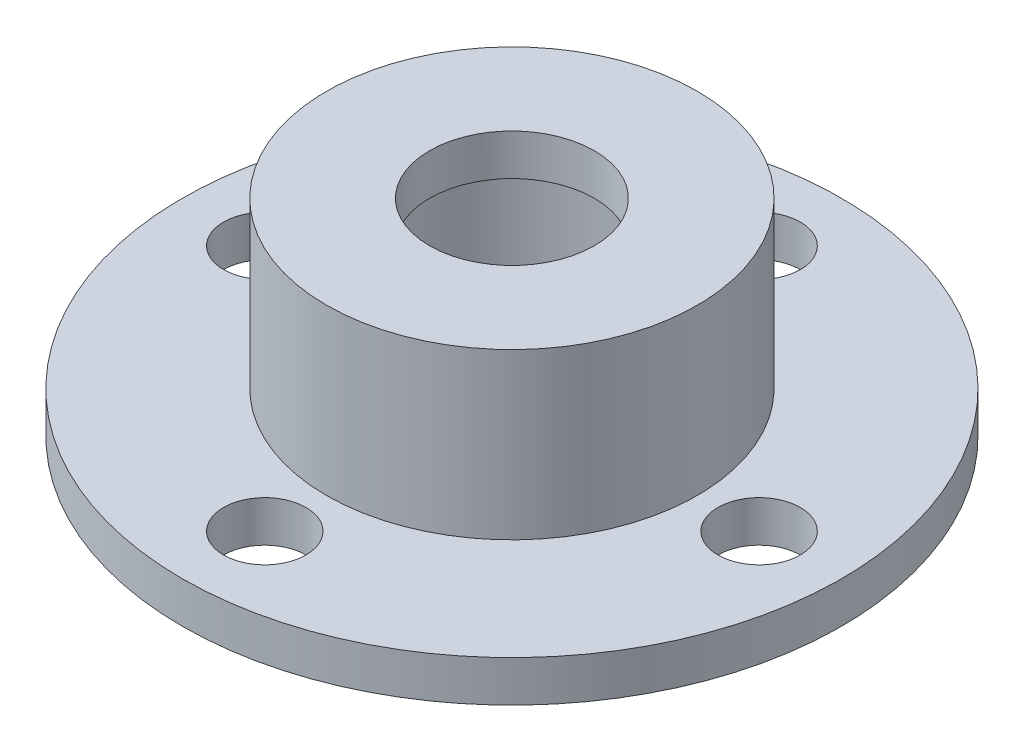
ISO-10303-21;
HEADER;
FILE_DESCRIPTION(('STEP AP214'),'2;1');
FILE_NAME('part.step','',(''),(''),'','','');
FILE_SCHEMA(('AUTOMOTIVE_DESIGN { 1 0 10303 214 1 1 1 1 }'));
ENDSEC;
DATA;
#1=APPLICATION_CONTEXT('core data for automotive mechanical design processes');
#2=APPLICATION_PROTOCOL_DEFINITION('international standard','automotive_design',2000,#1);
#3=PRODUCT_CONTEXT('',#1,'mechanical');
#4=PRODUCT('Part','Part','',(#3));
#5=PRODUCT_RELATED_PRODUCT_CATEGORY('part','',(#4));
#6=PRODUCT_DEFINITION_FORMATION('','',#4);
#7=PRODUCT_DEFINITION_CONTEXT('part definition',#1,'design');
#8=PRODUCT_DEFINITION('design','',#6,#7);
#9=PRODUCT_DEFINITION_SHAPE('','',#8);
#10=(LENGTH_UNIT() NAMED_UNIT(*) SI_UNIT(.MILLI.,.METRE.));
#11=(NAMED_UNIT(*) PLANE_ANGLE_UNIT() SI_UNIT($,.RADIAN.));
#12=(NAMED_UNIT(*) SI_UNIT($,.STERADIAN.) SOLID_ANGLE_UNIT());
#13=UNCERTAINTY_MEASURE_WITH_UNIT(LENGTH_MEASURE(1.E-05),#10,'distance_accuracy_value','');
#14=(GEOMETRIC_REPRESENTATION_CONTEXT(3) GLOBAL_UNCERTAINTY_ASSIGNED_CONTEXT((#13)) GLOBAL_UNIT_ASSIGNED_CONTEXT((#10,
#11,#12)) REPRESENTATION_CONTEXT('',''));
#15=CARTESIAN_POINT('',(0.,0.,0.));
#16=DIRECTION('',(0.,0.,1.));
#17=DIRECTION('',(1.,0.,0.));
#18=AXIS2_PLACEMENT_3D('',#15,#16,#17);
#19=CARTESIAN_POINT('',(0.,25.4,0.));
#20=DIRECTION('',(0.,-1.,0.));
#21=DIRECTION('',(0.,0.,-1.));
#22=AXIS2_PLACEMENT_3D('',#19,#20,#21);
#23=CYLINDRICAL_SURFACE('',#22,50.8);
#24=CARTESIAN_POINT('',(0.,127.,0.));
#25=DIRECTION('',(0.,1.,0.));
#26=DIRECTION('',(0.,0.,1.));
#27=AXIS2_PLACEMENT_3D('',#24,#25,#26);
#28=CIRCLE('',#27,50.8);
#29=CARTESIAN_POINT('',(0.,127.,50.8));
#30=VERTEX_POINT('',#29);
#31=EDGE_CURVE('E128',#30,#30,#28,.T.);
#32=ORIENTED_EDGE('',*,*,#31,.T.);
#33=EDGE_LOOP('',(#32));
#34=FACE_BOUND('',#33,.T.);
#35=CARTESIAN_POINT('',(0.,101.6,0.));
#36=DIRECTION('',(0.,-1.,0.));
#37=DIRECTION('',(0.,0.,-1.));
#38=AXIS2_PLACEMENT_3D('',#35,#36,#37);
#39=CIRCLE('',#38,50.8);
#40=CARTESIAN_POINT('',(0.,101.6,-50.8));
#41=VERTEX_POINT('',#40);
#42=EDGE_CURVE('E35',#41,#41,#39,.T.);
#43=ORIENTED_EDGE('',*,*,#42,.T.);
#44=EDGE_LOOP('',(#43));
#45=FACE_BOUND('',#44,.T.);
#46=ADVANCED_FACE('F31',(#34,#45),#23,.F.);
#47=CARTESIAN_POINT('',(0.,25.4,0.));
#48=DIRECTION('',(0.,1.,0.));
#49=DIRECTION('',(0.,0.,1.));
#50=AXIS2_PLACEMENT_3D('',#47,#48,#49);
#51=PLANE('',#50);
#52=CARTESIAN_POINT('',(0.,25.4,152.4));
#53=DIRECTION('',(0.,1.,0.));
#54=DIRECTION('',(0.,0.,1.));
#55=AXIS2_PLACEMENT_3D('',#52,#53,#54);
#56=CIRCLE('',#55,25.4);
#57=CARTESIAN_POINT('',(0.,25.4,177.8));
#58=VERTEX_POINT('',#57);
#59=EDGE_CURVE('E10',#58,#58,#56,.T.);
#60=ORIENTED_EDGE('',*,*,#59,.F.);
#61=EDGE_LOOP('',(#60));
#62=FACE_BOUND('',#61,.T.);
#63=CARTESIAN_POINT('',(152.4,25.4,0.));
#64=DIRECTION('',(0.,1.,0.));
#65=DIRECTION('',(0.,0.,1.));
#66=AXIS2_PLACEMENT_3D('',#63,#64,#65);
#67=CIRCLE('',#66,25.4);
#68=CARTESIAN_POINT('',(152.4,25.4,25.4));
#69=VERTEX_POINT('',#68);
#70=EDGE_CURVE('E39',#69,#69,#67,.T.);
#71=ORIENTED_EDGE('',*,*,#70,.F.);
#72=EDGE_LOOP('',(#71));
#73=FACE_BOUND('',#72,.T.);
#74=CARTESIAN_POINT('',(0.,25.4,0.));
#75=DIRECTION('',(0.,1.,0.));
#76=DIRECTION('',(0.,0.,1.));
#77=AXIS2_PLACEMENT_3D('',#74,#75,#76);
#78=CIRCLE('',#77,203.2);
#79=CARTESIAN_POINT('',(0.,25.4,203.2));
#80=VERTEX_POINT('',#79);
#81=EDGE_CURVE('E44',#80,#80,#78,.T.);
#82=ORIENTED_EDGE('',*,*,#81,.T.);
#83=EDGE_LOOP('',(#82));
#84=FACE_BOUND('',#83,.T.);
#85=CARTESIAN_POINT('',(-152.4,25.4,0.));
#86=DIRECTION('',(0.,1.,0.));
#87=DIRECTION('',(0.,0.,1.));
#88=AXIS2_PLACEMENT_3D('',#85,#86,#87);
#89=CIRCLE('',#88,25.4);
#90=CARTESIAN_POINT('',(-152.4,25.4,25.4));
#91=VERTEX_POINT('',#90);
#92=EDGE_CURVE('E66',#91,#91,#89,.T.);
#93=ORIENTED_EDGE('',*,*,#92,.F.);
#94=EDGE_LOOP('',(#93));
#95=FACE_BOUND('',#94,.T.);
#96=CARTESIAN_POINT('',(0.,25.4,-152.4));
#97=DIRECTION('',(0.,1.,0.));
#98=DIRECTION('',(0.,0.,1.));
#99=AXIS2_PLACEMENT_3D('',#96,#97,#98);
#100=CIRCLE('',#99,25.4);
#101=CARTESIAN_POINT('',(0.,25.4,-127.));
#102=VERTEX_POINT('',#101);
#103=EDGE_CURVE('E62',#102,#102,#100,.T.);
#104=ORIENTED_EDGE('',*,*,#103,.F.);
#105=EDGE_LOOP('',(#104));
#106=FACE_BOUND('',#105,.T.);
#107=CARTESIAN_POINT('',(0.,25.4,0.));
#108=DIRECTION('',(0.,1.,0.));
#109=DIRECTION('',(0.,0.,1.));
#110=AXIS2_PLACEMENT_3D('',#107,#108,#109);
#111=CIRCLE('',#110,114.3);
#112=CARTESIAN_POINT('',(0.,25.4,114.3));
#113=VERTEX_POINT('',#112);
#114=EDGE_CURVE('E73',#113,#113,#111,.T.);
#115=ORIENTED_EDGE('',*,*,#114,.F.);
#116=EDGE_LOOP('',(#115));
#117=FACE_BOUND('',#116,.T.);
#118=ADVANCED_FACE('F78',(#62,#73,#84,#95,#106,#117),#51,.T.);
#119=CARTESIAN_POINT('',(152.4,25.4,0.));
#120=DIRECTION('',(0.,-1.,0.));
#121=DIRECTION('',(0.,0.,-1.));
#122=AXIS2_PLACEMENT_3D('',#119,#120,#121);
#123=CYLINDRICAL_SURFACE('',#122,25.4);
#124=ORIENTED_EDGE('',*,*,#70,.T.);
#125=EDGE_LOOP('',(#124));
#126=FACE_BOUND('',#125,.T.);
#127=CARTESIAN_POINT('',(152.4,0.,0.));
#128=DIRECTION('',(0.,1.,0.));
#129=DIRECTION('',(0.,0.,1.));
#130=AXIS2_PLACEMENT_3D('',#127,#128,#129);
#131=CIRCLE('',#130,25.4);
#132=CARTESIAN_POINT('',(152.4,0.,25.4));
#133=VERTEX_POINT('',#132);
#134=EDGE_CURVE('E58',#133,#133,#131,.T.);
#135=ORIENTED_EDGE('',*,*,#134,.F.);
#136=EDGE_LOOP('',(#135));
#137=FACE_BOUND('',#136,.T.);
#138=ADVANCED_FACE('F85',(#126,#137),#123,.F.);
#139=CARTESIAN_POINT('',(0.,25.4,0.));
#140=DIRECTION('',(0.,-1.,0.));
#141=DIRECTION('',(0.,0.,-1.));
#142=AXIS2_PLACEMENT_3D('',#139,#140,#141);
#143=CYLINDRICAL_SURFACE('',#142,203.2);
#144=ORIENTED_EDGE('',*,*,#81,.F.);
#145=EDGE_LOOP('',(#144));
#146=FACE_BOUND('',#145,.T.);
#147=CARTESIAN_POINT('',(0.,0.,0.));
#148=DIRECTION('',(0.,1.,0.));
#149=DIRECTION('',(0.,0.,1.));
#150=AXIS2_PLACEMENT_3D('',#147,#148,#149);
#151=CIRCLE('',#150,203.2);
#152=CARTESIAN_POINT('',(0.,0.,203.2));
#153=VERTEX_POINT('',#152);
#154=EDGE_CURVE('E55',#153,#153,#151,.T.);
#155=ORIENTED_EDGE('',*,*,#154,.T.);
#156=EDGE_LOOP('',(#155));
#157=FACE_BOUND('',#156,.T.);
#158=ADVANCED_FACE('F81',(#146,#157),#143,.T.);
#159=CARTESIAN_POINT('',(-152.4,25.4,0.));
#160=DIRECTION('',(0.,-1.,0.));
#161=DIRECTION('',(0.,0.,-1.));
#162=AXIS2_PLACEMENT_3D('',#159,#160,#161);
#163=CYLINDRICAL_SURFACE('',#162,25.4);
#164=ORIENTED_EDGE('',*,*,#92,.T.);
#165=EDGE_LOOP('',(#164));
#166=FACE_BOUND('',#165,.T.);
#167=CARTESIAN_POINT('',(-152.4,0.,0.));
#168=DIRECTION('',(0.,1.,0.));
#169=DIRECTION('',(0.,0.,1.));
#170=AXIS2_PLACEMENT_3D('',#167,#168,#169);
#171=CIRCLE('',#170,25.4);
#172=CARTESIAN_POINT('',(-152.4,0.,25.4));
#173=VERTEX_POINT('',#172);
#174=EDGE_CURVE('E51',#173,#173,#171,.T.);
#175=ORIENTED_EDGE('',*,*,#174,.F.);
#176=EDGE_LOOP('',(#175));
#177=FACE_BOUND('',#176,.T.);
#178=ADVANCED_FACE('F84',(#166,#177),#163,.F.);
#179=CARTESIAN_POINT('',(0.,25.4,-152.4));
#180=DIRECTION('',(0.,-1.,0.));
#181=DIRECTION('',(0.,0.,-1.));
#182=AXIS2_PLACEMENT_3D('',#179,#180,#181);
#183=CYLINDRICAL_SURFACE('',#182,25.4);
#184=ORIENTED_EDGE('',*,*,#103,.T.);
#185=EDGE_LOOP('',(#184));
#186=FACE_BOUND('',#185,.T.);
#187=CARTESIAN_POINT('',(0.,0.,-152.4));
#188=DIRECTION('',(0.,1.,0.));
#189=DIRECTION('',(0.,0.,1.));
#190=AXIS2_PLACEMENT_3D('',#187,#188,#189);
#191=CIRCLE('',#190,25.4);
#192=CARTESIAN_POINT('',(0.,0.,-127.));
#193=VERTEX_POINT('',#192);
#194=EDGE_CURVE('E48',#193,#193,#191,.T.);
#195=ORIENTED_EDGE('',*,*,#194,.F.);
#196=EDGE_LOOP('',(#195));
#197=FACE_BOUND('',#196,.T.);
#198=ADVANCED_FACE('F33',(#186,#197),#183,.F.);
#199=CARTESIAN_POINT('',(0.,25.4,152.4));
#200=DIRECTION('',(0.,-1.,0.));
#201=DIRECTION('',(0.,0.,-1.));
#202=AXIS2_PLACEMENT_3D('',#199,#200,#201);
#203=CYLINDRICAL_SURFACE('',#202,25.4);
#204=ORIENTED_EDGE('',*,*,#59,.T.);
#205=EDGE_LOOP('',(#204));
#206=FACE_BOUND('',#205,.T.);
#207=CARTESIAN_POINT('',(0.,0.,152.4));
#208=DIRECTION('',(0.,1.,0.));
#209=DIRECTION('',(0.,0.,1.));
#210=AXIS2_PLACEMENT_3D('',#207,#208,#209);
#211=CIRCLE('',#210,25.4);
#212=CARTESIAN_POINT('',(0.,0.,177.8));
#213=VERTEX_POINT('',#212);
#214=EDGE_CURVE('E60',#213,#213,#211,.T.);
#215=ORIENTED_EDGE('',*,*,#214,.F.);
#216=EDGE_LOOP('',(#215));
#217=FACE_BOUND('',#216,.T.);
#218=ADVANCED_FACE('F93',(#206,#217),#203,.F.);
#219=CARTESIAN_POINT('',(0.,0.,0.));
#220=DIRECTION('',(0.,1.,0.));
#221=DIRECTION('',(0.,0.,1.));
#222=AXIS2_PLACEMENT_3D('',#219,#220,#221);
#223=PLANE('',#222);
#224=CARTESIAN_POINT('',(0.,0.,0.));
#225=DIRECTION('',(0.,-1.,0.));
#226=DIRECTION('',(0.,0.,-1.));
#227=AXIS2_PLACEMENT_3D('',#224,#225,#226);
#228=CIRCLE('',#227,76.2);
#229=CARTESIAN_POINT('',(0.,0.,-76.2));
#230=VERTEX_POINT('',#229);
#231=EDGE_CURVE('E135',#230,#230,#228,.T.);
#232=ORIENTED_EDGE('',*,*,#231,.F.);
#233=EDGE_LOOP('',(#232));
#234=FACE_BOUND('',#233,.T.);
#235=ORIENTED_EDGE('',*,*,#194,.T.);
#236=EDGE_LOOP('',(#235));
#237=FACE_BOUND('',#236,.T.);
#238=ORIENTED_EDGE('',*,*,#174,.T.);
#239=EDGE_LOOP('',(#238));
#240=FACE_BOUND('',#239,.T.);
#241=ORIENTED_EDGE('',*,*,#154,.F.);
#242=EDGE_LOOP('',(#241));
#243=FACE_BOUND('',#242,.T.);
#244=ORIENTED_EDGE('',*,*,#134,.T.);
#245=EDGE_LOOP('',(#244));
#246=FACE_BOUND('',#245,.T.);
#247=ORIENTED_EDGE('',*,*,#214,.T.);
#248=EDGE_LOOP('',(#247));
#249=FACE_BOUND('',#248,.T.);
#250=ADVANCED_FACE('F89',(#234,#237,#240,#243,#246,#249),#223,.F.);
#251=CARTESIAN_POINT('',(0.,127.,0.));
#252=DIRECTION('',(0.,1.,0.));
#253=DIRECTION('',(0.,0.,1.));
#254=AXIS2_PLACEMENT_3D('',#251,#252,#253);
#255=PLANE('',#254);
#256=CARTESIAN_POINT('',(0.,127.,0.));
#257=DIRECTION('',(0.,1.,0.));
#258=DIRECTION('',(0.,0.,1.));
#259=AXIS2_PLACEMENT_3D('',#256,#257,#258);
#260=CIRCLE('',#259,114.3);
#261=CARTESIAN_POINT('',(0.,127.,114.3));
#262=VERTEX_POINT('',#261);
#263=EDGE_CURVE('E52',#262,#262,#260,.T.);
#264=ORIENTED_EDGE('',*,*,#263,.T.);
#265=EDGE_LOOP('',(#264));
#266=FACE_BOUND('',#265,.T.);
#267=ORIENTED_EDGE('',*,*,#31,.F.);
#268=EDGE_LOOP('',(#267));
#269=FACE_BOUND('',#268,.T.);
#270=ADVANCED_FACE('F92',(#266,#269),#255,.T.);
#271=CARTESIAN_POINT('',(0.,127.,0.));
#272=DIRECTION('',(0.,-1.,0.));
#273=DIRECTION('',(0.,0.,-1.));
#274=AXIS2_PLACEMENT_3D('',#271,#272,#273);
#275=CYLINDRICAL_SURFACE('',#274,114.3);
#276=ORIENTED_EDGE('',*,*,#263,.F.);
#277=EDGE_LOOP('',(#276));
#278=FACE_BOUND('',#277,.T.);
#279=ORIENTED_EDGE('',*,*,#114,.T.);
#280=EDGE_LOOP('',(#279));
#281=FACE_BOUND('',#280,.T.);
#282=ADVANCED_FACE('F146',(#278,#281),#275,.T.);
#283=CARTESIAN_POINT('',(0.,101.6,0.));
#284=DIRECTION('',(0.,-1.,0.));
#285=DIRECTION('',(0.,0.,-1.));
#286=AXIS2_PLACEMENT_3D('',#283,#284,#285);
#287=CYLINDRICAL_SURFACE('',#286,76.2);
#288=CARTESIAN_POINT('',(0.,101.6,0.));
#289=DIRECTION('',(0.,-1.,0.));
#290=DIRECTION('',(0.,0.,-1.));
#291=AXIS2_PLACEMENT_3D('',#288,#289,#290);
#292=CIRCLE('',#291,76.2);
#293=CARTESIAN_POINT('',(0.,101.6,-76.2));
#294=VERTEX_POINT('',#293);
#295=EDGE_CURVE('E133',#294,#294,#292,.T.);
#296=ORIENTED_EDGE('',*,*,#295,.F.);
#297=EDGE_LOOP('',(#296));
#298=FACE_BOUND('',#297,.T.);
#299=ORIENTED_EDGE('',*,*,#231,.T.);
#300=EDGE_LOOP('',(#299));
#301=FACE_BOUND('',#300,.T.);
#302=ADVANCED_FACE('F143',(#298,#301),#287,.F.);
#303=CARTESIAN_POINT('',(0.,101.6,0.));
#304=DIRECTION('',(0.,-1.,0.));
#305=DIRECTION('',(0.,0.,-1.));
#306=AXIS2_PLACEMENT_3D('',#303,#304,#305);
#307=PLANE('',#306);
#308=ORIENTED_EDGE('',*,*,#42,.F.);
#309=EDGE_LOOP('',(#308));
#310=FACE_BOUND('',#309,.T.);
#311=ORIENTED_EDGE('',*,*,#295,.T.);
#312=EDGE_LOOP('',(#311));
#313=FACE_BOUND('',#312,.T.);
#314=ADVANCED_FACE('F141',(#310,#313),#307,.T.);
#315=CLOSED_SHELL('',(#46,#118,#138,#158,#178,#198,#218,#250,#270,#282,#302,#314));
#316=MANIFOLD_SOLID_BREP('B2',#315);
#317=ADVANCED_BREP_SHAPE_REPRESENTATION('',(#18,#316),#14);
#318=SHAPE_DEFINITION_REPRESENTATION(#9,#317);
ENDSEC;
END-ISO-10303-21;
